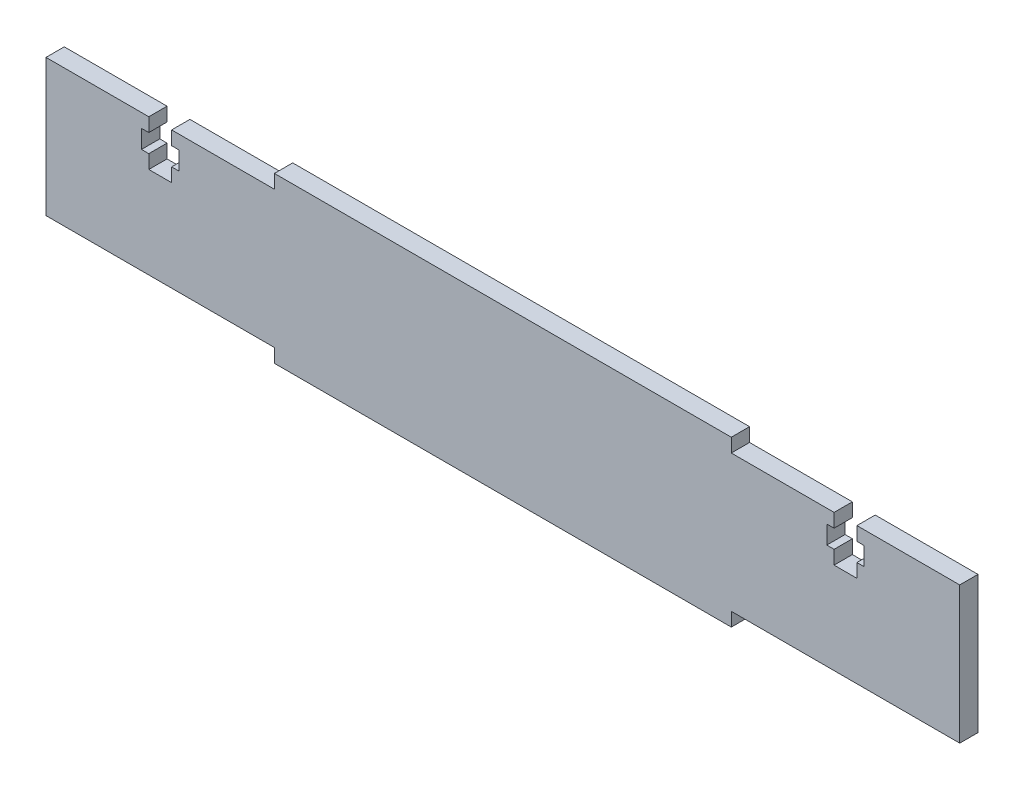
ISO-10303-21;
HEADER;
FILE_DESCRIPTION(('STEP AP214'),'2;1');
FILE_NAME('part.step','',(''),(''),'','','');
FILE_SCHEMA(('AUTOMOTIVE_DESIGN { 1 0 10303 214 1 1 1 1 }'));
ENDSEC;
DATA;
#1=APPLICATION_CONTEXT('core data for automotive mechanical design processes');
#2=APPLICATION_PROTOCOL_DEFINITION('international standard','automotive_design',2000,#1);
#3=PRODUCT_CONTEXT('',#1,'mechanical');
#4=PRODUCT('Part','Part','',(#3));
#5=PRODUCT_RELATED_PRODUCT_CATEGORY('part','',(#4));
#6=PRODUCT_DEFINITION_FORMATION('','',#4);
#7=PRODUCT_DEFINITION_CONTEXT('part definition',#1,'design');
#8=PRODUCT_DEFINITION('design','',#6,#7);
#9=PRODUCT_DEFINITION_SHAPE('','',#8);
#10=(LENGTH_UNIT() NAMED_UNIT(*) SI_UNIT(.MILLI.,.METRE.));
#11=(NAMED_UNIT(*) PLANE_ANGLE_UNIT() SI_UNIT($,.RADIAN.));
#12=(NAMED_UNIT(*) SI_UNIT($,.STERADIAN.) SOLID_ANGLE_UNIT());
#13=UNCERTAINTY_MEASURE_WITH_UNIT(LENGTH_MEASURE(1.E-05),#10,'distance_accuracy_value','');
#14=(GEOMETRIC_REPRESENTATION_CONTEXT(3) GLOBAL_UNCERTAINTY_ASSIGNED_CONTEXT((#13)) GLOBAL_UNIT_ASSIGNED_CONTEXT((#10,
#11,#12)) REPRESENTATION_CONTEXT('',''));
#15=CARTESIAN_POINT('',(0.,0.,0.));
#16=DIRECTION('',(0.,0.,1.));
#17=DIRECTION('',(1.,0.,0.));
#18=AXIS2_PLACEMENT_3D('',#15,#16,#17);
#19=CARTESIAN_POINT('',(0.,15.,4.));
#20=DIRECTION('',(0.,-1.,0.));
#21=DIRECTION('',(1.,0.,0.));
#22=AXIS2_PLACEMENT_3D('',#19,#20,#21);
#23=PLANE('',#22);
#24=DIRECTION('',(0.,0.,-1.));
#25=VECTOR('',#24,1.);
#26=CARTESIAN_POINT('',(77.5,15.,4.));
#27=LINE('',#26,#25);
#28=CARTESIAN_POINT('',(77.5,15.,4.));
#29=VERTEX_POINT('',#28);
#30=CARTESIAN_POINT('',(77.5,15.,0.));
#31=VERTEX_POINT('',#30);
#32=EDGE_CURVE('E379',#29,#31,#27,.T.);
#33=ORIENTED_EDGE('',*,*,#32,.F.);
#34=DIRECTION('',(-1.,0.,0.));
#35=VECTOR('',#34,1.);
#36=CARTESIAN_POINT('',(0.,15.,4.));
#37=LINE('',#36,#35);
#38=CARTESIAN_POINT('',(100.,15.,4.));
#39=VERTEX_POINT('',#38);
#40=EDGE_CURVE('E434',#39,#29,#37,.T.);
#41=ORIENTED_EDGE('',*,*,#40,.F.);
#42=DIRECTION('',(0.,0.,-1.));
#43=VECTOR('',#42,1.);
#44=CARTESIAN_POINT('',(100.,15.,4.));
#45=LINE('',#44,#43);
#46=CARTESIAN_POINT('',(100.,15.,0.));
#47=VERTEX_POINT('',#46);
#48=EDGE_CURVE('E464',#39,#47,#45,.T.);
#49=ORIENTED_EDGE('',*,*,#48,.T.);
#50=DIRECTION('',(-1.,0.,0.));
#51=VECTOR('',#50,1.);
#52=CARTESIAN_POINT('',(0.,15.,0.));
#53=LINE('',#52,#51);
#54=EDGE_CURVE('E465',#47,#31,#53,.T.);
#55=ORIENTED_EDGE('',*,*,#54,.T.);
#56=EDGE_LOOP('',(#33,#41,#49,#55));
#57=FACE_BOUND('',#56,.T.);
#58=ADVANCED_FACE('F83',(#57),#23,.F.);
#59=DIRECTION('',(0.,0.,-1.));
#60=VECTOR('',#59,1.);
#61=CARTESIAN_POINT('',(-72.5,15.,4.));
#62=LINE('',#61,#60);
#63=CARTESIAN_POINT('',(-72.5,15.,4.));
#64=VERTEX_POINT('',#63);
#65=CARTESIAN_POINT('',(-72.5,15.,0.));
#66=VERTEX_POINT('',#65);
#67=EDGE_CURVE('E431',#64,#66,#62,.T.);
#68=ORIENTED_EDGE('',*,*,#67,.F.);
#69=CARTESIAN_POINT('',(-50.,15.,4.));
#70=VERTEX_POINT('',#69);
#71=EDGE_CURVE('E439',#70,#64,#37,.T.);
#72=ORIENTED_EDGE('',*,*,#71,.F.);
#73=DIRECTION('',(0.,0.,-1.));
#74=VECTOR('',#73,1.);
#75=CARTESIAN_POINT('',(-50.,15.,4.));
#76=LINE('',#75,#74);
#77=CARTESIAN_POINT('',(-50.,15.,0.));
#78=VERTEX_POINT('',#77);
#79=EDGE_CURVE('E513',#70,#78,#76,.T.);
#80=ORIENTED_EDGE('',*,*,#79,.T.);
#81=EDGE_CURVE('E469',#78,#66,#53,.T.);
#82=ORIENTED_EDGE('',*,*,#81,.T.);
#83=EDGE_LOOP('',(#68,#72,#80,#82));
#84=FACE_BOUND('',#83,.T.);
#85=ADVANCED_FACE('F590',(#84),#23,.F.);
#86=CARTESIAN_POINT('',(72.5,15.,4.));
#87=VERTEX_POINT('',#86);
#88=CARTESIAN_POINT('',(50.,15.,4.));
#89=VERTEX_POINT('',#88);
#90=EDGE_CURVE('E438',#87,#89,#37,.T.);
#91=ORIENTED_EDGE('',*,*,#90,.F.);
#92=DIRECTION('',(0.,0.,-1.));
#93=VECTOR('',#92,1.);
#94=CARTESIAN_POINT('',(72.5,15.,4.));
#95=LINE('',#94,#93);
#96=CARTESIAN_POINT('',(72.5,15.,0.));
#97=VERTEX_POINT('',#96);
#98=EDGE_CURVE('E376',#87,#97,#95,.T.);
#99=ORIENTED_EDGE('',*,*,#98,.T.);
#100=CARTESIAN_POINT('',(50.,15.,0.));
#101=VERTEX_POINT('',#100);
#102=EDGE_CURVE('E433',#97,#101,#53,.T.);
#103=ORIENTED_EDGE('',*,*,#102,.T.);
#104=DIRECTION('',(0.,0.,-1.));
#105=VECTOR('',#104,1.);
#106=CARTESIAN_POINT('',(50.,15.,4.));
#107=LINE('',#106,#105);
#108=EDGE_CURVE('E520',#89,#101,#107,.T.);
#109=ORIENTED_EDGE('',*,*,#108,.F.);
#110=EDGE_LOOP('',(#91,#99,#103,#109));
#111=FACE_BOUND('',#110,.T.);
#112=ADVANCED_FACE('F606',(#111),#23,.F.);
#113=CARTESIAN_POINT('',(50.,0.,4.));
#114=DIRECTION('',(-1.,0.,0.));
#115=DIRECTION('',(0.,0.,1.));
#116=AXIS2_PLACEMENT_3D('',#113,#114,#115);
#117=PLANE('',#116);
#118=DIRECTION('',(0.,1.,0.));
#119=VECTOR('',#118,1.);
#120=CARTESIAN_POINT('',(50.,0.,0.));
#121=LINE('',#120,#119);
#122=CARTESIAN_POINT('',(50.,18.,0.));
#123=VERTEX_POINT('',#122);
#124=EDGE_CURVE('E468',#101,#123,#121,.T.);
#125=ORIENTED_EDGE('',*,*,#124,.T.);
#126=DIRECTION('',(0.,0.,-1.));
#127=VECTOR('',#126,1.);
#128=CARTESIAN_POINT('',(50.,18.,4.));
#129=LINE('',#128,#127);
#130=CARTESIAN_POINT('',(50.,18.,4.));
#131=VERTEX_POINT('',#130);
#132=EDGE_CURVE('E517',#131,#123,#129,.T.);
#133=ORIENTED_EDGE('',*,*,#132,.F.);
#134=DIRECTION('',(0.,1.,0.));
#135=VECTOR('',#134,1.);
#136=CARTESIAN_POINT('',(50.,0.,4.));
#137=LINE('',#136,#135);
#138=EDGE_CURVE('E437',#89,#131,#137,.T.);
#139=ORIENTED_EDGE('',*,*,#138,.F.);
#140=ORIENTED_EDGE('',*,*,#108,.T.);
#141=EDGE_LOOP('',(#125,#133,#139,#140));
#142=FACE_BOUND('',#141,.T.);
#143=ADVANCED_FACE('F85',(#142),#117,.F.);
#144=CARTESIAN_POINT('',(0.,18.,4.));
#145=DIRECTION('',(0.,-1.,0.));
#146=DIRECTION('',(1.,0.,0.));
#147=AXIS2_PLACEMENT_3D('',#144,#145,#146);
#148=PLANE('',#147);
#149=DIRECTION('',(-1.,0.,0.));
#150=VECTOR('',#149,1.);
#151=CARTESIAN_POINT('',(0.,18.,0.));
#152=LINE('',#151,#150);
#153=CARTESIAN_POINT('',(-50.,18.,0.));
#154=VERTEX_POINT('',#153);
#155=EDGE_CURVE('E471',#123,#154,#152,.T.);
#156=ORIENTED_EDGE('',*,*,#155,.T.);
#157=DIRECTION('',(0.,0.,-1.));
#158=VECTOR('',#157,1.);
#159=CARTESIAN_POINT('',(-50.,18.,4.));
#160=LINE('',#159,#158);
#161=CARTESIAN_POINT('',(-50.,18.,4.));
#162=VERTEX_POINT('',#161);
#163=EDGE_CURVE('E515',#162,#154,#160,.T.);
#164=ORIENTED_EDGE('',*,*,#163,.F.);
#165=DIRECTION('',(-1.,0.,0.));
#166=VECTOR('',#165,1.);
#167=CARTESIAN_POINT('',(0.,18.,4.));
#168=LINE('',#167,#166);
#169=EDGE_CURVE('E441',#131,#162,#168,.T.);
#170=ORIENTED_EDGE('',*,*,#169,.F.);
#171=ORIENTED_EDGE('',*,*,#132,.T.);
#172=EDGE_LOOP('',(#156,#164,#170,#171));
#173=FACE_BOUND('',#172,.T.);
#174=ADVANCED_FACE('F601',(#173),#148,.F.);
#175=CARTESIAN_POINT('',(-50.,0.,4.));
#176=DIRECTION('',(-1.,0.,0.));
#177=DIRECTION('',(0.,0.,1.));
#178=AXIS2_PLACEMENT_3D('',#175,#176,#177);
#179=PLANE('',#178);
#180=DIRECTION('',(0.,1.,0.));
#181=VECTOR('',#180,1.);
#182=CARTESIAN_POINT('',(-50.,0.,0.));
#183=LINE('',#182,#181);
#184=EDGE_CURVE('E474',#78,#154,#183,.T.);
#185=ORIENTED_EDGE('',*,*,#184,.F.);
#186=ORIENTED_EDGE('',*,*,#79,.F.);
#187=DIRECTION('',(0.,1.,0.));
#188=VECTOR('',#187,1.);
#189=CARTESIAN_POINT('',(-50.,0.,4.));
#190=LINE('',#189,#188);
#191=EDGE_CURVE('E443',#70,#162,#190,.T.);
#192=ORIENTED_EDGE('',*,*,#191,.T.);
#193=ORIENTED_EDGE('',*,*,#163,.T.);
#194=EDGE_LOOP('',(#185,#186,#192,#193));
#195=FACE_BOUND('',#194,.T.);
#196=ADVANCED_FACE('F596',(#195),#179,.T.);
#197=CARTESIAN_POINT('',(-77.5,15.,4.));
#198=VERTEX_POINT('',#197);
#199=CARTESIAN_POINT('',(-100.,15.,4.));
#200=VERTEX_POINT('',#199);
#201=EDGE_CURVE('E446',#198,#200,#37,.T.);
#202=ORIENTED_EDGE('',*,*,#201,.F.);
#203=DIRECTION('',(0.,0.,-1.));
#204=VECTOR('',#203,1.);
#205=CARTESIAN_POINT('',(-77.5,15.,4.));
#206=LINE('',#205,#204);
#207=CARTESIAN_POINT('',(-77.5,15.,0.));
#208=VERTEX_POINT('',#207);
#209=EDGE_CURVE('E428',#198,#208,#206,.T.);
#210=ORIENTED_EDGE('',*,*,#209,.T.);
#211=CARTESIAN_POINT('',(-100.,15.,0.));
#212=VERTEX_POINT('',#211);
#213=EDGE_CURVE('E477',#208,#212,#53,.T.);
#214=ORIENTED_EDGE('',*,*,#213,.T.);
#215=DIRECTION('',(0.,0.,-1.));
#216=VECTOR('',#215,1.);
#217=CARTESIAN_POINT('',(-100.,15.,4.));
#218=LINE('',#217,#216);
#219=EDGE_CURVE('E510',#200,#212,#218,.T.);
#220=ORIENTED_EDGE('',*,*,#219,.F.);
#221=EDGE_LOOP('',(#202,#210,#214,#220));
#222=FACE_BOUND('',#221,.T.);
#223=ADVANCED_FACE('F657',(#222),#23,.F.);
#224=CARTESIAN_POINT('',(-100.,0.,4.));
#225=DIRECTION('',(-1.,0.,0.));
#226=DIRECTION('',(0.,-1.,0.));
#227=AXIS2_PLACEMENT_3D('',#224,#225,#226);
#228=PLANE('',#227);
#229=DIRECTION('',(0.,1.,0.));
#230=VECTOR('',#229,1.);
#231=CARTESIAN_POINT('',(-100.,0.,0.));
#232=LINE('',#231,#230);
#233=CARTESIAN_POINT('',(-100.,-15.,0.));
#234=VERTEX_POINT('',#233);
#235=EDGE_CURVE('E478',#234,#212,#232,.T.);
#236=ORIENTED_EDGE('',*,*,#235,.F.);
#237=DIRECTION('',(0.,0.,-1.));
#238=VECTOR('',#237,1.);
#239=CARTESIAN_POINT('',(-100.,-15.,4.));
#240=LINE('',#239,#238);
#241=CARTESIAN_POINT('',(-100.,-15.,4.));
#242=VERTEX_POINT('',#241);
#243=EDGE_CURVE('E508',#242,#234,#240,.T.);
#244=ORIENTED_EDGE('',*,*,#243,.F.);
#245=DIRECTION('',(0.,1.,0.));
#246=VECTOR('',#245,1.);
#247=CARTESIAN_POINT('',(-100.,0.,4.));
#248=LINE('',#247,#246);
#249=EDGE_CURVE('E447',#242,#200,#248,.T.);
#250=ORIENTED_EDGE('',*,*,#249,.T.);
#251=ORIENTED_EDGE('',*,*,#219,.T.);
#252=EDGE_LOOP('',(#236,#244,#250,#251));
#253=FACE_BOUND('',#252,.T.);
#254=ADVANCED_FACE('F656',(#253),#228,.T.);
#255=CARTESIAN_POINT('',(0.,-15.,4.));
#256=DIRECTION('',(0.,-1.,0.));
#257=DIRECTION('',(1.,0.,0.));
#258=AXIS2_PLACEMENT_3D('',#255,#256,#257);
#259=PLANE('',#258);
#260=DIRECTION('',(-1.,0.,0.));
#261=VECTOR('',#260,1.);
#262=CARTESIAN_POINT('',(0.,-15.,0.));
#263=LINE('',#262,#261);
#264=CARTESIAN_POINT('',(-50.0000000000001,-15.,0.));
#265=VERTEX_POINT('',#264);
#266=EDGE_CURVE('E481',#265,#234,#263,.T.);
#267=ORIENTED_EDGE('',*,*,#266,.F.);
#268=DIRECTION('',(0.,0.,-1.));
#269=VECTOR('',#268,1.);
#270=CARTESIAN_POINT('',(-50.0000000000001,-15.,4.));
#271=LINE('',#270,#269);
#272=CARTESIAN_POINT('',(-50.0000000000001,-15.,4.));
#273=VERTEX_POINT('',#272);
#274=EDGE_CURVE('E506',#273,#265,#271,.T.);
#275=ORIENTED_EDGE('',*,*,#274,.F.);
#276=DIRECTION('',(-1.,0.,0.));
#277=VECTOR('',#276,1.);
#278=CARTESIAN_POINT('',(0.,-15.,4.));
#279=LINE('',#278,#277);
#280=EDGE_CURVE('E450',#273,#242,#279,.T.);
#281=ORIENTED_EDGE('',*,*,#280,.T.);
#282=ORIENTED_EDGE('',*,*,#243,.T.);
#283=EDGE_LOOP('',(#267,#275,#281,#282));
#284=FACE_BOUND('',#283,.T.);
#285=ADVANCED_FACE('F664',(#284),#259,.T.);
#286=CARTESIAN_POINT('',(-50.0000000000001,0.,4.));
#287=DIRECTION('',(-1.,0.,0.));
#288=DIRECTION('',(0.,0.,1.));
#289=AXIS2_PLACEMENT_3D('',#286,#287,#288);
#290=PLANE('',#289);
#291=DIRECTION('',(0.,1.,0.));
#292=VECTOR('',#291,1.);
#293=CARTESIAN_POINT('',(-50.0000000000001,0.,0.));
#294=LINE('',#293,#292);
#295=CARTESIAN_POINT('',(-50.0000000000001,-18.,0.));
#296=VERTEX_POINT('',#295);
#297=EDGE_CURVE('E484',#296,#265,#294,.T.);
#298=ORIENTED_EDGE('',*,*,#297,.F.);
#299=DIRECTION('',(0.,0.,-1.));
#300=VECTOR('',#299,1.);
#301=CARTESIAN_POINT('',(-50.0000000000001,-18.,4.));
#302=LINE('',#301,#300);
#303=CARTESIAN_POINT('',(-50.0000000000001,-18.,4.));
#304=VERTEX_POINT('',#303);
#305=EDGE_CURVE('E504',#304,#296,#302,.T.);
#306=ORIENTED_EDGE('',*,*,#305,.F.);
#307=DIRECTION('',(0.,1.,0.));
#308=VECTOR('',#307,1.);
#309=CARTESIAN_POINT('',(-50.0000000000001,0.,4.));
#310=LINE('',#309,#308);
#311=EDGE_CURVE('E453',#304,#273,#310,.T.);
#312=ORIENTED_EDGE('',*,*,#311,.T.);
#313=ORIENTED_EDGE('',*,*,#274,.T.);
#314=EDGE_LOOP('',(#298,#306,#312,#313));
#315=FACE_BOUND('',#314,.T.);
#316=ADVANCED_FACE('F841',(#315),#290,.T.);
#317=CARTESIAN_POINT('',(0.,-18.,4.));
#318=DIRECTION('',(0.,-1.,0.));
#319=DIRECTION('',(1.,0.,0.));
#320=AXIS2_PLACEMENT_3D('',#317,#318,#319);
#321=PLANE('',#320);
#322=DIRECTION('',(-1.,0.,0.));
#323=VECTOR('',#322,1.);
#324=CARTESIAN_POINT('',(0.,-18.,0.));
#325=LINE('',#324,#323);
#326=CARTESIAN_POINT('',(49.9999999999999,-18.,0.));
#327=VERTEX_POINT('',#326);
#328=EDGE_CURVE('E488',#327,#296,#325,.T.);
#329=ORIENTED_EDGE('',*,*,#328,.F.);
#330=DIRECTION('',(0.,0.,-1.));
#331=VECTOR('',#330,1.);
#332=CARTESIAN_POINT('',(49.9999999999999,-18.,4.));
#333=LINE('',#332,#331);
#334=CARTESIAN_POINT('',(49.9999999999999,-18.,4.));
#335=VERTEX_POINT('',#334);
#336=EDGE_CURVE('E502',#335,#327,#333,.T.);
#337=ORIENTED_EDGE('',*,*,#336,.F.);
#338=DIRECTION('',(-1.,0.,0.));
#339=VECTOR('',#338,1.);
#340=CARTESIAN_POINT('',(0.,-18.,4.));
#341=LINE('',#340,#339);
#342=EDGE_CURVE('E457',#335,#304,#341,.T.);
#343=ORIENTED_EDGE('',*,*,#342,.T.);
#344=ORIENTED_EDGE('',*,*,#305,.T.);
#345=EDGE_LOOP('',(#329,#337,#343,#344));
#346=FACE_BOUND('',#345,.T.);
#347=ADVANCED_FACE('F837',(#346),#321,.T.);
#348=CARTESIAN_POINT('',(49.9999999999999,0.,4.));
#349=DIRECTION('',(-1.,0.,0.));
#350=DIRECTION('',(0.,0.,1.));
#351=AXIS2_PLACEMENT_3D('',#348,#349,#350);
#352=PLANE('',#351);
#353=DIRECTION('',(0.,1.,0.));
#354=VECTOR('',#353,1.);
#355=CARTESIAN_POINT('',(49.9999999999999,0.,0.));
#356=LINE('',#355,#354);
#357=CARTESIAN_POINT('',(49.9999999999999,-15.,0.));
#358=VERTEX_POINT('',#357);
#359=EDGE_CURVE('E491',#327,#358,#356,.T.);
#360=ORIENTED_EDGE('',*,*,#359,.T.);
#361=DIRECTION('',(0.,0.,-1.));
#362=VECTOR('',#361,1.);
#363=CARTESIAN_POINT('',(49.9999999999999,-15.,4.));
#364=LINE('',#363,#362);
#365=CARTESIAN_POINT('',(49.9999999999999,-15.,4.));
#366=VERTEX_POINT('',#365);
#367=EDGE_CURVE('E500',#366,#358,#364,.T.);
#368=ORIENTED_EDGE('',*,*,#367,.F.);
#369=DIRECTION('',(0.,1.,0.));
#370=VECTOR('',#369,1.);
#371=CARTESIAN_POINT('',(49.9999999999999,0.,4.));
#372=LINE('',#371,#370);
#373=EDGE_CURVE('E460',#335,#366,#372,.T.);
#374=ORIENTED_EDGE('',*,*,#373,.F.);
#375=ORIENTED_EDGE('',*,*,#336,.T.);
#376=EDGE_LOOP('',(#360,#368,#374,#375));
#377=FACE_BOUND('',#376,.T.);
#378=ADVANCED_FACE('F833',(#377),#352,.F.);
#379=CARTESIAN_POINT('',(100.,-15.,0.));
#380=VERTEX_POINT('',#379);
#381=EDGE_CURVE('E485',#380,#358,#263,.T.);
#382=ORIENTED_EDGE('',*,*,#381,.F.);
#383=DIRECTION('',(0.,0.,-1.));
#384=VECTOR('',#383,1.);
#385=CARTESIAN_POINT('',(100.,-15.,4.));
#386=LINE('',#385,#384);
#387=CARTESIAN_POINT('',(100.,-15.,4.));
#388=VERTEX_POINT('',#387);
#389=EDGE_CURVE('E498',#388,#380,#386,.T.);
#390=ORIENTED_EDGE('',*,*,#389,.F.);
#391=EDGE_CURVE('E454',#388,#366,#279,.T.);
#392=ORIENTED_EDGE('',*,*,#391,.T.);
#393=ORIENTED_EDGE('',*,*,#367,.T.);
#394=EDGE_LOOP('',(#382,#390,#392,#393));
#395=FACE_BOUND('',#394,.T.);
#396=ADVANCED_FACE('F829',(#395),#259,.T.);
#397=CARTESIAN_POINT('',(100.,0.,4.));
#398=DIRECTION('',(-1.,0.,0.));
#399=DIRECTION('',(0.,0.,1.));
#400=AXIS2_PLACEMENT_3D('',#397,#398,#399);
#401=PLANE('',#400);
#402=DIRECTION('',(0.,1.,0.));
#403=VECTOR('',#402,1.);
#404=CARTESIAN_POINT('',(100.,0.,0.));
#405=LINE('',#404,#403);
#406=EDGE_CURVE('E494',#380,#47,#405,.T.);
#407=ORIENTED_EDGE('',*,*,#406,.T.);
#408=ORIENTED_EDGE('',*,*,#48,.F.);
#409=DIRECTION('',(0.,1.,0.));
#410=VECTOR('',#409,1.);
#411=CARTESIAN_POINT('',(100.,0.,4.));
#412=LINE('',#411,#410);
#413=EDGE_CURVE('E462',#388,#39,#412,.T.);
#414=ORIENTED_EDGE('',*,*,#413,.F.);
#415=ORIENTED_EDGE('',*,*,#389,.T.);
#416=EDGE_LOOP('',(#407,#408,#414,#415));
#417=FACE_BOUND('',#416,.T.);
#418=ADVANCED_FACE('F701',(#417),#401,.F.);
#419=CARTESIAN_POINT('',(0.,0.,4.));
#420=DIRECTION('',(0.,0.,1.));
#421=DIRECTION('',(1.,0.,0.));
#422=AXIS2_PLACEMENT_3D('',#419,#420,#421);
#423=PLANE('',#422);
#424=DIRECTION('',(0.,-1.,0.));
#425=VECTOR('',#424,1.);
#426=CARTESIAN_POINT('',(72.5,25.,4.));
#427=LINE('',#426,#425);
#428=CARTESIAN_POINT('',(72.5,12.,4.));
#429=VERTEX_POINT('',#428);
#430=EDGE_CURVE('E370',#87,#429,#427,.T.);
#431=ORIENTED_EDGE('',*,*,#430,.F.);
#432=ORIENTED_EDGE('',*,*,#90,.T.);
#433=ORIENTED_EDGE('',*,*,#138,.T.);
#434=ORIENTED_EDGE('',*,*,#169,.T.);
#435=ORIENTED_EDGE('',*,*,#191,.F.);
#436=ORIENTED_EDGE('',*,*,#71,.T.);
#437=DIRECTION('',(0.,-1.,0.));
#438=VECTOR('',#437,1.);
#439=CARTESIAN_POINT('',(-72.5,25.,4.));
#440=LINE('',#439,#438);
#441=CARTESIAN_POINT('',(-72.5,12.,4.));
#442=VERTEX_POINT('',#441);
#443=EDGE_CURVE('E382',#64,#442,#440,.T.);
#444=ORIENTED_EDGE('',*,*,#443,.T.);
#445=DIRECTION('',(-1.,0.,0.));
#446=VECTOR('',#445,1.);
#447=CARTESIAN_POINT('',(-70.9,12.,4.));
#448=LINE('',#447,#446);
#449=CARTESIAN_POINT('',(-70.9,12.,4.));
#450=VERTEX_POINT('',#449);
#451=EDGE_CURVE('E400',#450,#442,#448,.T.);
#452=ORIENTED_EDGE('',*,*,#451,.F.);
#453=DIRECTION('',(0.,1.,0.));
#454=VECTOR('',#453,1.);
#455=CARTESIAN_POINT('',(-70.9,7.99999999999997,4.));
#456=LINE('',#455,#454);
#457=CARTESIAN_POINT('',(-70.9,7.99999999999997,4.));
#458=VERTEX_POINT('',#457);
#459=EDGE_CURVE('E381',#458,#450,#456,.T.);
#460=ORIENTED_EDGE('',*,*,#459,.F.);
#461=DIRECTION('',(-1.,0.,0.));
#462=VECTOR('',#461,1.);
#463=CARTESIAN_POINT('',(-70.9,7.99999999999997,4.));
#464=LINE('',#463,#462);
#465=CARTESIAN_POINT('',(-72.5,7.99999999999997,4.));
#466=VERTEX_POINT('',#465);
#467=EDGE_CURVE('E407',#458,#466,#464,.T.);
#468=ORIENTED_EDGE('',*,*,#467,.T.);
#469=CARTESIAN_POINT('',(-72.5,4.99999999999997,4.));
#470=VERTEX_POINT('',#469);
#471=EDGE_CURVE('E386',#466,#470,#440,.T.);
#472=ORIENTED_EDGE('',*,*,#471,.T.);
#473=DIRECTION('',(1.,0.,0.));
#474=VECTOR('',#473,1.);
#475=CARTESIAN_POINT('',(-77.5,4.99999999999997,4.));
#476=LINE('',#475,#474);
#477=CARTESIAN_POINT('',(-77.5,4.99999999999997,4.));
#478=VERTEX_POINT('',#477);
#479=EDGE_CURVE('E385',#478,#470,#476,.T.);
#480=ORIENTED_EDGE('',*,*,#479,.F.);
#481=DIRECTION('',(0.,-1.,0.));
#482=VECTOR('',#481,1.);
#483=CARTESIAN_POINT('',(-77.5,25.,4.));
#484=LINE('',#483,#482);
#485=CARTESIAN_POINT('',(-77.5,7.99999999999997,4.));
#486=VERTEX_POINT('',#485);
#487=EDGE_CURVE('E389',#486,#478,#484,.T.);
#488=ORIENTED_EDGE('',*,*,#487,.F.);
#489=CARTESIAN_POINT('',(-79.1,7.99999999999997,4.));
#490=VERTEX_POINT('',#489);
#491=EDGE_CURVE('E406',#486,#490,#464,.T.);
#492=ORIENTED_EDGE('',*,*,#491,.T.);
#493=DIRECTION('',(0.,1.,0.));
#494=VECTOR('',#493,1.);
#495=CARTESIAN_POINT('',(-79.1,7.99999999999997,4.));
#496=LINE('',#495,#494);
#497=CARTESIAN_POINT('',(-79.1,12.,4.));
#498=VERTEX_POINT('',#497);
#499=EDGE_CURVE('E403',#490,#498,#496,.T.);
#500=ORIENTED_EDGE('',*,*,#499,.T.);
#501=CARTESIAN_POINT('',(-77.5,12.,4.));
#502=VERTEX_POINT('',#501);
#503=EDGE_CURVE('E399',#502,#498,#448,.T.);
#504=ORIENTED_EDGE('',*,*,#503,.F.);
#505=EDGE_CURVE('E390',#198,#502,#484,.T.);
#506=ORIENTED_EDGE('',*,*,#505,.F.);
#507=ORIENTED_EDGE('',*,*,#201,.T.);
#508=ORIENTED_EDGE('',*,*,#249,.F.);
#509=ORIENTED_EDGE('',*,*,#280,.F.);
#510=ORIENTED_EDGE('',*,*,#311,.F.);
#511=ORIENTED_EDGE('',*,*,#342,.F.);
#512=ORIENTED_EDGE('',*,*,#373,.T.);
#513=ORIENTED_EDGE('',*,*,#391,.F.);
#514=ORIENTED_EDGE('',*,*,#413,.T.);
#515=ORIENTED_EDGE('',*,*,#40,.T.);
#516=DIRECTION('',(0.,-1.,0.));
#517=VECTOR('',#516,1.);
#518=CARTESIAN_POINT('',(77.5,25.,4.));
#519=LINE('',#518,#517);
#520=CARTESIAN_POINT('',(77.5,12.,4.));
#521=VERTEX_POINT('',#520);
#522=EDGE_CURVE('E365',#29,#521,#519,.T.);
#523=ORIENTED_EDGE('',*,*,#522,.T.);
#524=DIRECTION('',(1.,0.,0.));
#525=VECTOR('',#524,1.);
#526=CARTESIAN_POINT('',(70.9,12.,4.));
#527=LINE('',#526,#525);
#528=CARTESIAN_POINT('',(79.1,12.,4.));
#529=VERTEX_POINT('',#528);
#530=EDGE_CURVE('E347',#521,#529,#527,.T.);
#531=ORIENTED_EDGE('',*,*,#530,.T.);
#532=DIRECTION('',(0.,1.,0.));
#533=VECTOR('',#532,1.);
#534=CARTESIAN_POINT('',(79.1,7.99999999999997,4.));
#535=LINE('',#534,#533);
#536=CARTESIAN_POINT('',(79.1,7.99999999999997,4.));
#537=VERTEX_POINT('',#536);
#538=EDGE_CURVE('E345',#537,#529,#535,.T.);
#539=ORIENTED_EDGE('',*,*,#538,.F.);
#540=DIRECTION('',(1.,0.,0.));
#541=VECTOR('',#540,1.);
#542=CARTESIAN_POINT('',(70.9,7.99999999999997,4.));
#543=LINE('',#542,#541);
#544=CARTESIAN_POINT('',(77.5,7.99999999999997,4.));
#545=VERTEX_POINT('',#544);
#546=EDGE_CURVE('E338',#545,#537,#543,.T.);
#547=ORIENTED_EDGE('',*,*,#546,.F.);
#548=CARTESIAN_POINT('',(77.5,4.99999999999997,4.));
#549=VERTEX_POINT('',#548);
#550=EDGE_CURVE('E364',#545,#549,#519,.T.);
#551=ORIENTED_EDGE('',*,*,#550,.T.);
#552=DIRECTION('',(-1.,0.,0.));
#553=VECTOR('',#552,1.);
#554=CARTESIAN_POINT('',(77.5,4.99999999999997,4.));
#555=LINE('',#554,#553);
#556=CARTESIAN_POINT('',(72.5,4.99999999999997,4.));
#557=VERTEX_POINT('',#556);
#558=EDGE_CURVE('E368',#549,#557,#555,.T.);
#559=ORIENTED_EDGE('',*,*,#558,.T.);
#560=CARTESIAN_POINT('',(72.5,7.99999999999997,4.));
#561=VERTEX_POINT('',#560);
#562=EDGE_CURVE('E344',#561,#557,#427,.T.);
#563=ORIENTED_EDGE('',*,*,#562,.F.);
#564=CARTESIAN_POINT('',(70.9,7.99999999999997,4.));
#565=VERTEX_POINT('',#564);
#566=EDGE_CURVE('E321',#565,#561,#543,.T.);
#567=ORIENTED_EDGE('',*,*,#566,.F.);
#568=DIRECTION('',(0.,1.,0.));
#569=VECTOR('',#568,1.);
#570=CARTESIAN_POINT('',(70.9,7.99999999999997,4.));
#571=LINE('',#570,#569);
#572=CARTESIAN_POINT('',(70.9,12.,4.));
#573=VERTEX_POINT('',#572);
#574=EDGE_CURVE('E331',#565,#573,#571,.T.);
#575=ORIENTED_EDGE('',*,*,#574,.T.);
#576=EDGE_CURVE('E328',#573,#429,#527,.T.);
#577=ORIENTED_EDGE('',*,*,#576,.T.);
#578=EDGE_LOOP('',(#431,#432,#433,#434,#435,#436,#444,#452,#460,#468,#472,#480,#488,#492,#500,
#504,#506,#507,#508,#509,#510,#511,#512,#513,#514,#515,#523,#531,#539,#547,#551,#559,#563,#567,
#575,#577));
#579=FACE_BOUND('',#578,.T.);
#580=ADVANCED_FACE('F341',(#579),#423,.T.);
#581=CARTESIAN_POINT('',(0.,0.,0.));
#582=DIRECTION('',(0.,0.,1.));
#583=DIRECTION('',(1.,0.,0.));
#584=AXIS2_PLACEMENT_3D('',#581,#582,#583);
#585=PLANE('',#584);
#586=ORIENTED_EDGE('',*,*,#102,.F.);
#587=DIRECTION('',(0.,-1.,0.));
#588=VECTOR('',#587,1.);
#589=CARTESIAN_POINT('',(72.5,0.,0.));
#590=LINE('',#589,#588);
#591=CARTESIAN_POINT('',(72.5,12.,0.));
#592=VERTEX_POINT('',#591);
#593=EDGE_CURVE('E12',#97,#592,#590,.T.);
#594=ORIENTED_EDGE('',*,*,#593,.T.);
#595=DIRECTION('',(1.,0.,0.));
#596=VECTOR('',#595,1.);
#597=CARTESIAN_POINT('',(0.,12.,0.));
#598=LINE('',#597,#596);
#599=CARTESIAN_POINT('',(70.9,12.,0.));
#600=VERTEX_POINT('',#599);
#601=EDGE_CURVE('E91',#600,#592,#598,.T.);
#602=ORIENTED_EDGE('',*,*,#601,.F.);
#603=DIRECTION('',(0.,1.,0.));
#604=VECTOR('',#603,1.);
#605=CARTESIAN_POINT('',(70.9,0.,0.));
#606=LINE('',#605,#604);
#607=CARTESIAN_POINT('',(70.9,7.99999999999997,0.));
#608=VERTEX_POINT('',#607);
#609=EDGE_CURVE('E569',#608,#600,#606,.T.);
#610=ORIENTED_EDGE('',*,*,#609,.F.);
#611=DIRECTION('',(1.,0.,0.));
#612=VECTOR('',#611,1.);
#613=CARTESIAN_POINT('',(0.,7.99999999999997,0.));
#614=LINE('',#613,#612);
#615=CARTESIAN_POINT('',(72.5,7.99999999999997,0.));
#616=VERTEX_POINT('',#615);
#617=EDGE_CURVE('E324',#608,#616,#614,.T.);
#618=ORIENTED_EDGE('',*,*,#617,.T.);
#619=DIRECTION('',(0.,-1.,0.));
#620=VECTOR('',#619,1.);
#621=CARTESIAN_POINT('',(72.5,0.,0.));
#622=LINE('',#621,#620);
#623=CARTESIAN_POINT('',(72.5,4.99999999999997,0.));
#624=VERTEX_POINT('',#623);
#625=EDGE_CURVE('E565',#616,#624,#622,.T.);
#626=ORIENTED_EDGE('',*,*,#625,.T.);
#627=DIRECTION('',(-1.,0.,0.));
#628=VECTOR('',#627,1.);
#629=CARTESIAN_POINT('',(0.,4.99999999999997,0.));
#630=LINE('',#629,#628);
#631=CARTESIAN_POINT('',(77.5,4.99999999999997,0.));
#632=VERTEX_POINT('',#631);
#633=EDGE_CURVE('E563',#632,#624,#630,.T.);
#634=ORIENTED_EDGE('',*,*,#633,.F.);
#635=DIRECTION('',(0.,-1.,0.));
#636=VECTOR('',#635,1.);
#637=CARTESIAN_POINT('',(77.5,0.,0.));
#638=LINE('',#637,#636);
#639=CARTESIAN_POINT('',(77.5,7.99999999999997,0.));
#640=VERTEX_POINT('',#639);
#641=EDGE_CURVE('E559',#640,#632,#638,.T.);
#642=ORIENTED_EDGE('',*,*,#641,.F.);
#643=DIRECTION('',(1.,0.,0.));
#644=VECTOR('',#643,1.);
#645=CARTESIAN_POINT('',(0.,7.99999999999997,0.));
#646=LINE('',#645,#644);
#647=CARTESIAN_POINT('',(79.1,7.99999999999997,0.));
#648=VERTEX_POINT('',#647);
#649=EDGE_CURVE('E554',#640,#648,#646,.T.);
#650=ORIENTED_EDGE('',*,*,#649,.T.);
#651=DIRECTION('',(0.,1.,0.));
#652=VECTOR('',#651,1.);
#653=CARTESIAN_POINT('',(79.1,0.,0.));
#654=LINE('',#653,#652);
#655=CARTESIAN_POINT('',(79.1,12.,0.));
#656=VERTEX_POINT('',#655);
#657=EDGE_CURVE('E551',#648,#656,#654,.T.);
#658=ORIENTED_EDGE('',*,*,#657,.T.);
#659=DIRECTION('',(1.,0.,0.));
#660=VECTOR('',#659,1.);
#661=CARTESIAN_POINT('',(0.,12.,0.));
#662=LINE('',#661,#660);
#663=CARTESIAN_POINT('',(77.5,12.,0.));
#664=VERTEX_POINT('',#663);
#665=EDGE_CURVE('E557',#664,#656,#662,.T.);
#666=ORIENTED_EDGE('',*,*,#665,.F.);
#667=DIRECTION('',(0.,-1.,0.));
#668=VECTOR('',#667,1.);
#669=CARTESIAN_POINT('',(77.5,0.,0.));
#670=LINE('',#669,#668);
#671=EDGE_CURVE('E561',#31,#664,#670,.T.);
#672=ORIENTED_EDGE('',*,*,#671,.F.);
#673=ORIENTED_EDGE('',*,*,#54,.F.);
#674=ORIENTED_EDGE('',*,*,#406,.F.);
#675=ORIENTED_EDGE('',*,*,#381,.T.);
#676=ORIENTED_EDGE('',*,*,#359,.F.);
#677=ORIENTED_EDGE('',*,*,#328,.T.);
#678=ORIENTED_EDGE('',*,*,#297,.T.);
#679=ORIENTED_EDGE('',*,*,#266,.T.);
#680=ORIENTED_EDGE('',*,*,#235,.T.);
#681=ORIENTED_EDGE('',*,*,#213,.F.);
#682=DIRECTION('',(0.,-1.,0.));
#683=VECTOR('',#682,1.);
#684=CARTESIAN_POINT('',(-77.5,0.,0.));
#685=LINE('',#684,#683);
#686=CARTESIAN_POINT('',(-77.5,12.,0.));
#687=VERTEX_POINT('',#686);
#688=EDGE_CURVE('E548',#208,#687,#685,.T.);
#689=ORIENTED_EDGE('',*,*,#688,.T.);
#690=DIRECTION('',(-1.,0.,0.));
#691=VECTOR('',#690,1.);
#692=CARTESIAN_POINT('',(0.,12.,0.));
#693=LINE('',#692,#691);
#694=CARTESIAN_POINT('',(-79.1,12.,0.));
#695=VERTEX_POINT('',#694);
#696=EDGE_CURVE('E545',#687,#695,#693,.T.);
#697=ORIENTED_EDGE('',*,*,#696,.T.);
#698=DIRECTION('',(0.,1.,0.));
#699=VECTOR('',#698,1.);
#700=CARTESIAN_POINT('',(-79.1,0.,0.));
#701=LINE('',#700,#699);
#702=CARTESIAN_POINT('',(-79.1,7.99999999999997,0.));
#703=VERTEX_POINT('',#702);
#704=EDGE_CURVE('E543',#703,#695,#701,.T.);
#705=ORIENTED_EDGE('',*,*,#704,.F.);
#706=DIRECTION('',(-1.,0.,0.));
#707=VECTOR('',#706,1.);
#708=CARTESIAN_POINT('',(0.,7.99999999999997,0.));
#709=LINE('',#708,#707);
#710=CARTESIAN_POINT('',(-77.5,7.99999999999997,0.));
#711=VERTEX_POINT('',#710);
#712=EDGE_CURVE('E541',#711,#703,#709,.T.);
#713=ORIENTED_EDGE('',*,*,#712,.F.);
#714=DIRECTION('',(0.,-1.,0.));
#715=VECTOR('',#714,1.);
#716=CARTESIAN_POINT('',(-77.5,0.,0.));
#717=LINE('',#716,#715);
#718=CARTESIAN_POINT('',(-77.5,4.99999999999997,0.));
#719=VERTEX_POINT('',#718);
#720=EDGE_CURVE('E538',#711,#719,#717,.T.);
#721=ORIENTED_EDGE('',*,*,#720,.T.);
#722=DIRECTION('',(1.,0.,0.));
#723=VECTOR('',#722,1.);
#724=CARTESIAN_POINT('',(0.,4.99999999999997,0.));
#725=LINE('',#724,#723);
#726=CARTESIAN_POINT('',(-72.5,4.99999999999997,0.));
#727=VERTEX_POINT('',#726);
#728=EDGE_CURVE('E535',#719,#727,#725,.T.);
#729=ORIENTED_EDGE('',*,*,#728,.T.);
#730=DIRECTION('',(0.,-1.,0.));
#731=VECTOR('',#730,1.);
#732=CARTESIAN_POINT('',(-72.5,0.,0.));
#733=LINE('',#732,#731);
#734=CARTESIAN_POINT('',(-72.5,7.99999999999997,0.));
#735=VERTEX_POINT('',#734);
#736=EDGE_CURVE('E531',#735,#727,#733,.T.);
#737=ORIENTED_EDGE('',*,*,#736,.F.);
#738=DIRECTION('',(-1.,0.,0.));
#739=VECTOR('',#738,1.);
#740=CARTESIAN_POINT('',(0.,7.99999999999997,0.));
#741=LINE('',#740,#739);
#742=CARTESIAN_POINT('',(-70.9,7.99999999999997,0.));
#743=VERTEX_POINT('',#742);
#744=EDGE_CURVE('E523',#743,#735,#741,.T.);
#745=ORIENTED_EDGE('',*,*,#744,.F.);
#746=DIRECTION('',(0.,1.,0.));
#747=VECTOR('',#746,1.);
#748=CARTESIAN_POINT('',(-70.9,0.,0.));
#749=LINE('',#748,#747);
#750=CARTESIAN_POINT('',(-70.9,12.,0.));
#751=VERTEX_POINT('',#750);
#752=EDGE_CURVE('E525',#743,#751,#749,.T.);
#753=ORIENTED_EDGE('',*,*,#752,.T.);
#754=DIRECTION('',(-1.,0.,0.));
#755=VECTOR('',#754,1.);
#756=CARTESIAN_POINT('',(0.,12.,0.));
#757=LINE('',#756,#755);
#758=CARTESIAN_POINT('',(-72.5,12.,0.));
#759=VERTEX_POINT('',#758);
#760=EDGE_CURVE('E528',#751,#759,#757,.T.);
#761=ORIENTED_EDGE('',*,*,#760,.T.);
#762=DIRECTION('',(0.,-1.,0.));
#763=VECTOR('',#762,1.);
#764=CARTESIAN_POINT('',(-72.5,0.,0.));
#765=LINE('',#764,#763);
#766=EDGE_CURVE('E533',#66,#759,#765,.T.);
#767=ORIENTED_EDGE('',*,*,#766,.F.);
#768=ORIENTED_EDGE('',*,*,#81,.F.);
#769=ORIENTED_EDGE('',*,*,#184,.T.);
#770=ORIENTED_EDGE('',*,*,#155,.F.);
#771=ORIENTED_EDGE('',*,*,#124,.F.);
#772=EDGE_LOOP('',(#586,#594,#602,#610,#618,#626,#634,#642,#650,#658,#666,#672,#673,#674,#675,
#676,#677,#678,#679,#680,#681,#689,#697,#705,#713,#721,#729,#737,#745,#753,#761,#767,#768,#769,
#770,#771));
#773=FACE_BOUND('',#772,.T.);
#774=ADVANCED_FACE('F578',(#773),#585,.F.);
#775=CARTESIAN_POINT('',(-72.5,25.,-6.));
#776=DIRECTION('',(-1.,0.,0.));
#777=DIRECTION('',(0.,0.,1.));
#778=AXIS2_PLACEMENT_3D('',#775,#776,#777);
#779=PLANE('',#778);
#780=ORIENTED_EDGE('',*,*,#67,.T.);
#781=ORIENTED_EDGE('',*,*,#766,.T.);
#782=DIRECTION('',(0.,0.,-1.));
#783=VECTOR('',#782,1.);
#784=CARTESIAN_POINT('',(-72.5,12.,-6.));
#785=LINE('',#784,#783);
#786=EDGE_CURVE('E420',#442,#759,#785,.T.);
#787=ORIENTED_EDGE('',*,*,#786,.F.);
#788=ORIENTED_EDGE('',*,*,#443,.F.);
#789=EDGE_LOOP('',(#780,#781,#787,#788));
#790=FACE_BOUND('',#789,.T.);
#791=ADVANCED_FACE('F613',(#790),#779,.T.);
#792=CARTESIAN_POINT('',(-77.5,25.,-6.));
#793=DIRECTION('',(-1.,0.,0.));
#794=DIRECTION('',(0.,0.,1.));
#795=AXIS2_PLACEMENT_3D('',#792,#793,#794);
#796=PLANE('',#795);
#797=ORIENTED_EDGE('',*,*,#505,.T.);
#798=DIRECTION('',(0.,0.,-1.));
#799=VECTOR('',#798,1.);
#800=CARTESIAN_POINT('',(-77.5,12.,-6.));
#801=LINE('',#800,#799);
#802=EDGE_CURVE('E396',#502,#687,#801,.T.);
#803=ORIENTED_EDGE('',*,*,#802,.T.);
#804=ORIENTED_EDGE('',*,*,#688,.F.);
#805=ORIENTED_EDGE('',*,*,#209,.F.);
#806=EDGE_LOOP('',(#797,#803,#804,#805));
#807=FACE_BOUND('',#806,.T.);
#808=ADVANCED_FACE('F652',(#807),#796,.F.);
#809=ORIENTED_EDGE('',*,*,#736,.T.);
#810=DIRECTION('',(0.,0.,1.));
#811=VECTOR('',#810,1.);
#812=CARTESIAN_POINT('',(-72.5,4.99999999999997,-6.));
#813=LINE('',#812,#811);
#814=EDGE_CURVE('E394',#727,#470,#813,.T.);
#815=ORIENTED_EDGE('',*,*,#814,.T.);
#816=ORIENTED_EDGE('',*,*,#471,.F.);
#817=DIRECTION('',(0.,0.,-1.));
#818=VECTOR('',#817,1.);
#819=CARTESIAN_POINT('',(-72.5,7.99999999999997,-6.));
#820=LINE('',#819,#818);
#821=EDGE_CURVE('E423',#466,#735,#820,.T.);
#822=ORIENTED_EDGE('',*,*,#821,.T.);
#823=EDGE_LOOP('',(#809,#815,#816,#822));
#824=FACE_BOUND('',#823,.T.);
#825=ADVANCED_FACE('F626',(#824),#779,.T.);
#826=CARTESIAN_POINT('',(-77.5,4.99999999999997,-6.));
#827=DIRECTION('',(0.,-1.,0.));
#828=DIRECTION('',(0.,0.,-1.));
#829=AXIS2_PLACEMENT_3D('',#826,#827,#828);
#830=PLANE('',#829);
#831=DIRECTION('',(0.,0.,1.));
#832=VECTOR('',#831,1.);
#833=CARTESIAN_POINT('',(-77.5,4.99999999999997,-6.));
#834=LINE('',#833,#832);
#835=EDGE_CURVE('E392',#719,#478,#834,.T.);
#836=ORIENTED_EDGE('',*,*,#835,.T.);
#837=ORIENTED_EDGE('',*,*,#479,.T.);
#838=ORIENTED_EDGE('',*,*,#814,.F.);
#839=ORIENTED_EDGE('',*,*,#728,.F.);
#840=EDGE_LOOP('',(#836,#837,#838,#839));
#841=FACE_BOUND('',#840,.T.);
#842=ADVANCED_FACE('F629',(#841),#830,.F.);
#843=DIRECTION('',(0.,0.,-1.));
#844=VECTOR('',#843,1.);
#845=CARTESIAN_POINT('',(-77.5,7.99999999999997,-6.));
#846=LINE('',#845,#844);
#847=EDGE_CURVE('E419',#486,#711,#846,.T.);
#848=ORIENTED_EDGE('',*,*,#847,.F.);
#849=ORIENTED_EDGE('',*,*,#487,.T.);
#850=ORIENTED_EDGE('',*,*,#835,.F.);
#851=ORIENTED_EDGE('',*,*,#720,.F.);
#852=EDGE_LOOP('',(#848,#849,#850,#851));
#853=FACE_BOUND('',#852,.T.);
#854=ADVANCED_FACE('F636',(#853),#796,.F.);
#855=CARTESIAN_POINT('',(-79.1,7.99999999999997,-6.));
#856=DIRECTION('',(1.,0.,0.));
#857=DIRECTION('',(0.,0.,-1.));
#858=AXIS2_PLACEMENT_3D('',#855,#856,#857);
#859=PLANE('',#858);
#860=ORIENTED_EDGE('',*,*,#704,.T.);
#861=DIRECTION('',(0.,0.,1.));
#862=VECTOR('',#861,1.);
#863=CARTESIAN_POINT('',(-79.1,12.,-6.));
#864=LINE('',#863,#862);
#865=EDGE_CURVE('E414',#695,#498,#864,.T.);
#866=ORIENTED_EDGE('',*,*,#865,.T.);
#867=ORIENTED_EDGE('',*,*,#499,.F.);
#868=DIRECTION('',(0.,0.,1.));
#869=VECTOR('',#868,1.);
#870=CARTESIAN_POINT('',(-79.1,7.99999999999997,-6.));
#871=LINE('',#870,#869);
#872=EDGE_CURVE('E412',#703,#490,#871,.T.);
#873=ORIENTED_EDGE('',*,*,#872,.F.);
#874=EDGE_LOOP('',(#860,#866,#867,#873));
#875=FACE_BOUND('',#874,.T.);
#876=ADVANCED_FACE('F644',(#875),#859,.T.);
#877=CARTESIAN_POINT('',(-70.9,12.,-6.));
#878=DIRECTION('',(0.,1.,0.));
#879=DIRECTION('',(0.,0.,1.));
#880=AXIS2_PLACEMENT_3D('',#877,#878,#879);
#881=PLANE('',#880);
#882=ORIENTED_EDGE('',*,*,#802,.F.);
#883=ORIENTED_EDGE('',*,*,#503,.T.);
#884=ORIENTED_EDGE('',*,*,#865,.F.);
#885=ORIENTED_EDGE('',*,*,#696,.F.);
#886=EDGE_LOOP('',(#882,#883,#884,#885));
#887=FACE_BOUND('',#886,.T.);
#888=ADVANCED_FACE('F650',(#887),#881,.F.);
#889=CARTESIAN_POINT('',(-70.9,7.99999999999997,-6.));
#890=DIRECTION('',(0.,1.,0.));
#891=DIRECTION('',(0.,0.,1.));
#892=AXIS2_PLACEMENT_3D('',#889,#890,#891);
#893=PLANE('',#892);
#894=ORIENTED_EDGE('',*,*,#712,.T.);
#895=ORIENTED_EDGE('',*,*,#872,.T.);
#896=ORIENTED_EDGE('',*,*,#491,.F.);
#897=ORIENTED_EDGE('',*,*,#847,.T.);
#898=EDGE_LOOP('',(#894,#895,#896,#897));
#899=FACE_BOUND('',#898,.T.);
#900=ADVANCED_FACE('F639',(#899),#893,.T.);
#901=DIRECTION('',(0.,0.,1.));
#902=VECTOR('',#901,1.);
#903=CARTESIAN_POINT('',(-70.9,12.,-6.));
#904=LINE('',#903,#902);
#905=EDGE_CURVE('E410',#751,#450,#904,.T.);
#906=ORIENTED_EDGE('',*,*,#905,.T.);
#907=ORIENTED_EDGE('',*,*,#451,.T.);
#908=ORIENTED_EDGE('',*,*,#786,.T.);
#909=ORIENTED_EDGE('',*,*,#760,.F.);
#910=EDGE_LOOP('',(#906,#907,#908,#909));
#911=FACE_BOUND('',#910,.T.);
#912=ADVANCED_FACE('F615',(#911),#881,.F.);
#913=CARTESIAN_POINT('',(-70.9,7.99999999999997,-6.));
#914=DIRECTION('',(1.,0.,0.));
#915=DIRECTION('',(0.,0.,-1.));
#916=AXIS2_PLACEMENT_3D('',#913,#914,#915);
#917=PLANE('',#916);
#918=DIRECTION('',(0.,0.,1.));
#919=VECTOR('',#918,1.);
#920=CARTESIAN_POINT('',(-70.9,7.99999999999997,-6.));
#921=LINE('',#920,#919);
#922=EDGE_CURVE('E106',#743,#458,#921,.T.);
#923=ORIENTED_EDGE('',*,*,#922,.T.);
#924=ORIENTED_EDGE('',*,*,#459,.T.);
#925=ORIENTED_EDGE('',*,*,#905,.F.);
#926=ORIENTED_EDGE('',*,*,#752,.F.);
#927=EDGE_LOOP('',(#923,#924,#925,#926));
#928=FACE_BOUND('',#927,.T.);
#929=ADVANCED_FACE('F618',(#928),#917,.F.);
#930=ORIENTED_EDGE('',*,*,#744,.T.);
#931=ORIENTED_EDGE('',*,*,#821,.F.);
#932=ORIENTED_EDGE('',*,*,#467,.F.);
#933=ORIENTED_EDGE('',*,*,#922,.F.);
#934=EDGE_LOOP('',(#930,#931,#932,#933));
#935=FACE_BOUND('',#934,.T.);
#936=ADVANCED_FACE('F622',(#935),#893,.T.);
#937=CARTESIAN_POINT('',(77.5,25.,-6.));
#938=DIRECTION('',(-1.,0.,0.));
#939=DIRECTION('',(0.,0.,1.));
#940=AXIS2_PLACEMENT_3D('',#937,#938,#939);
#941=PLANE('',#940);
#942=ORIENTED_EDGE('',*,*,#32,.T.);
#943=ORIENTED_EDGE('',*,*,#671,.T.);
#944=DIRECTION('',(0.,0.,1.));
#945=VECTOR('',#944,1.);
#946=CARTESIAN_POINT('',(77.5,12.,-6.));
#947=LINE('',#946,#945);
#948=EDGE_CURVE('E362',#664,#521,#947,.T.);
#949=ORIENTED_EDGE('',*,*,#948,.T.);
#950=ORIENTED_EDGE('',*,*,#522,.F.);
#951=EDGE_LOOP('',(#942,#943,#949,#950));
#952=FACE_BOUND('',#951,.T.);
#953=ADVANCED_FACE('F719',(#952),#941,.T.);
#954=CARTESIAN_POINT('',(72.5,25.,-6.));
#955=DIRECTION('',(-1.,0.,0.));
#956=DIRECTION('',(0.,0.,1.));
#957=AXIS2_PLACEMENT_3D('',#954,#955,#956);
#958=PLANE('',#957);
#959=ORIENTED_EDGE('',*,*,#430,.T.);
#960=DIRECTION('',(0.,0.,1.));
#961=VECTOR('',#960,1.);
#962=CARTESIAN_POINT('',(72.5,12.,-6.));
#963=LINE('',#962,#961);
#964=EDGE_CURVE('E359',#592,#429,#963,.T.);
#965=ORIENTED_EDGE('',*,*,#964,.F.);
#966=ORIENTED_EDGE('',*,*,#593,.F.);
#967=ORIENTED_EDGE('',*,*,#98,.F.);
#968=EDGE_LOOP('',(#959,#965,#966,#967));
#969=FACE_BOUND('',#968,.T.);
#970=ADVANCED_FACE('F576',(#969),#958,.F.);
#971=ORIENTED_EDGE('',*,*,#641,.T.);
#972=DIRECTION('',(0.,0.,1.));
#973=VECTOR('',#972,1.);
#974=CARTESIAN_POINT('',(77.5,4.99999999999997,-6.));
#975=LINE('',#974,#973);
#976=EDGE_CURVE('E374',#632,#549,#975,.T.);
#977=ORIENTED_EDGE('',*,*,#976,.T.);
#978=ORIENTED_EDGE('',*,*,#550,.F.);
#979=DIRECTION('',(0.,0.,1.));
#980=VECTOR('',#979,1.);
#981=CARTESIAN_POINT('',(77.5,7.99999999999997,-6.));
#982=LINE('',#981,#980);
#983=EDGE_CURVE('E357',#640,#545,#982,.T.);
#984=ORIENTED_EDGE('',*,*,#983,.F.);
#985=EDGE_LOOP('',(#971,#977,#978,#984));
#986=FACE_BOUND('',#985,.T.);
#987=ADVANCED_FACE('F725',(#986),#941,.T.);
#988=CARTESIAN_POINT('',(77.5,4.99999999999997,-6.));
#989=DIRECTION('',(0.,1.,0.));
#990=DIRECTION('',(0.,0.,1.));
#991=AXIS2_PLACEMENT_3D('',#988,#989,#990);
#992=PLANE('',#991);
#993=ORIENTED_EDGE('',*,*,#633,.T.);
#994=DIRECTION('',(0.,0.,1.));
#995=VECTOR('',#994,1.);
#996=CARTESIAN_POINT('',(72.5,4.99999999999997,-6.));
#997=LINE('',#996,#995);
#998=EDGE_CURVE('E372',#624,#557,#997,.T.);
#999=ORIENTED_EDGE('',*,*,#998,.T.);
#1000=ORIENTED_EDGE('',*,*,#558,.F.);
#1001=ORIENTED_EDGE('',*,*,#976,.F.);
#1002=EDGE_LOOP('',(#993,#999,#1000,#1001));
#1003=FACE_BOUND('',#1002,.T.);
#1004=ADVANCED_FACE('F742',(#1003),#992,.T.);
#1005=DIRECTION('',(0.,0.,1.));
#1006=VECTOR('',#1005,1.);
#1007=CARTESIAN_POINT('',(72.5,7.99999999999997,-6.));
#1008=LINE('',#1007,#1006);
#1009=EDGE_CURVE('E353',#616,#561,#1008,.T.);
#1010=ORIENTED_EDGE('',*,*,#1009,.T.);
#1011=ORIENTED_EDGE('',*,*,#562,.T.);
#1012=ORIENTED_EDGE('',*,*,#998,.F.);
#1013=ORIENTED_EDGE('',*,*,#625,.F.);
#1014=EDGE_LOOP('',(#1010,#1011,#1012,#1013));
#1015=FACE_BOUND('',#1014,.T.);
#1016=ADVANCED_FACE('F734',(#1015),#958,.F.);
#1017=CARTESIAN_POINT('',(70.9,7.99999999999997,-6.));
#1018=DIRECTION('',(1.,0.,0.));
#1019=DIRECTION('',(0.,0.,-1.));
#1020=AXIS2_PLACEMENT_3D('',#1017,#1018,#1019);
#1021=PLANE('',#1020);
#1022=ORIENTED_EDGE('',*,*,#609,.T.);
#1023=DIRECTION('',(0.,0.,1.));
#1024=VECTOR('',#1023,1.);
#1025=CARTESIAN_POINT('',(70.9,12.,-6.));
#1026=LINE('',#1025,#1024);
#1027=EDGE_CURVE('E334',#600,#573,#1026,.T.);
#1028=ORIENTED_EDGE('',*,*,#1027,.T.);
#1029=ORIENTED_EDGE('',*,*,#574,.F.);
#1030=DIRECTION('',(0.,0.,1.));
#1031=VECTOR('',#1030,1.);
#1032=CARTESIAN_POINT('',(70.9,7.99999999999997,-6.));
#1033=LINE('',#1032,#1031);
#1034=EDGE_CURVE('E316',#608,#565,#1033,.T.);
#1035=ORIENTED_EDGE('',*,*,#1034,.F.);
#1036=EDGE_LOOP('',(#1022,#1028,#1029,#1035));
#1037=FACE_BOUND('',#1036,.T.);
#1038=ADVANCED_FACE('F332',(#1037),#1021,.T.);
#1039=CARTESIAN_POINT('',(70.9,7.99999999999997,-6.));
#1040=DIRECTION('',(0.,-1.,0.));
#1041=DIRECTION('',(0.,0.,-1.));
#1042=AXIS2_PLACEMENT_3D('',#1039,#1040,#1041);
#1043=PLANE('',#1042);
#1044=ORIENTED_EDGE('',*,*,#1034,.T.);
#1045=ORIENTED_EDGE('',*,*,#566,.T.);
#1046=ORIENTED_EDGE('',*,*,#1009,.F.);
#1047=ORIENTED_EDGE('',*,*,#617,.F.);
#1048=EDGE_LOOP('',(#1044,#1045,#1046,#1047));
#1049=FACE_BOUND('',#1048,.T.);
#1050=ADVANCED_FACE('F318',(#1049),#1043,.F.);
#1051=CARTESIAN_POINT('',(70.9,12.,-6.));
#1052=DIRECTION('',(0.,-1.,0.));
#1053=DIRECTION('',(0.,0.,-1.));
#1054=AXIS2_PLACEMENT_3D('',#1051,#1052,#1053);
#1055=PLANE('',#1054);
#1056=ORIENTED_EDGE('',*,*,#601,.T.);
#1057=ORIENTED_EDGE('',*,*,#964,.T.);
#1058=ORIENTED_EDGE('',*,*,#576,.F.);
#1059=ORIENTED_EDGE('',*,*,#1027,.F.);
#1060=EDGE_LOOP('',(#1056,#1057,#1058,#1059));
#1061=FACE_BOUND('',#1060,.T.);
#1062=ADVANCED_FACE('F573',(#1061),#1055,.T.);
#1063=ORIENTED_EDGE('',*,*,#665,.T.);
#1064=DIRECTION('',(0.,0.,1.));
#1065=VECTOR('',#1064,1.);
#1066=CARTESIAN_POINT('',(79.1,12.,-6.));
#1067=LINE('',#1066,#1065);
#1068=EDGE_CURVE('E98',#656,#529,#1067,.T.);
#1069=ORIENTED_EDGE('',*,*,#1068,.T.);
#1070=ORIENTED_EDGE('',*,*,#530,.F.);
#1071=ORIENTED_EDGE('',*,*,#948,.F.);
#1072=EDGE_LOOP('',(#1063,#1069,#1070,#1071));
#1073=FACE_BOUND('',#1072,.T.);
#1074=ADVANCED_FACE('F785',(#1073),#1055,.T.);
#1075=ORIENTED_EDGE('',*,*,#983,.T.);
#1076=ORIENTED_EDGE('',*,*,#546,.T.);
#1077=DIRECTION('',(0.,0.,1.));
#1078=VECTOR('',#1077,1.);
#1079=CARTESIAN_POINT('',(79.1,7.99999999999997,-6.));
#1080=LINE('',#1079,#1078);
#1081=EDGE_CURVE('E327',#648,#537,#1080,.T.);
#1082=ORIENTED_EDGE('',*,*,#1081,.F.);
#1083=ORIENTED_EDGE('',*,*,#649,.F.);
#1084=EDGE_LOOP('',(#1075,#1076,#1082,#1083));
#1085=FACE_BOUND('',#1084,.T.);
#1086=ADVANCED_FACE('F777',(#1085),#1043,.F.);
#1087=CARTESIAN_POINT('',(79.1,7.99999999999997,-6.));
#1088=DIRECTION('',(1.,0.,0.));
#1089=DIRECTION('',(0.,0.,-1.));
#1090=AXIS2_PLACEMENT_3D('',#1087,#1088,#1089);
#1091=PLANE('',#1090);
#1092=ORIENTED_EDGE('',*,*,#1081,.T.);
#1093=ORIENTED_EDGE('',*,*,#538,.T.);
#1094=ORIENTED_EDGE('',*,*,#1068,.F.);
#1095=ORIENTED_EDGE('',*,*,#657,.F.);
#1096=EDGE_LOOP('',(#1092,#1093,#1094,#1095));
#1097=FACE_BOUND('',#1096,.T.);
#1098=ADVANCED_FACE('F802',(#1097),#1091,.F.);
#1099=CLOSED_SHELL('',(#58,#85,#112,#143,#174,#196,#223,#254,#285,#316,#347,#378,#396,#418,#580,
#774,#791,#808,#825,#842,#854,#876,#888,#900,#912,#929,#936,#953,#970,#987,#1004,#1016,#1038,
#1050,#1062,#1074,#1086,#1098));
#1100=MANIFOLD_SOLID_BREP('B2',#1099);
#1101=ADVANCED_BREP_SHAPE_REPRESENTATION('',(#18,#1100),#14);
#1102=SHAPE_DEFINITION_REPRESENTATION(#9,#1101);
ENDSEC;
END-ISO-10303-21;
